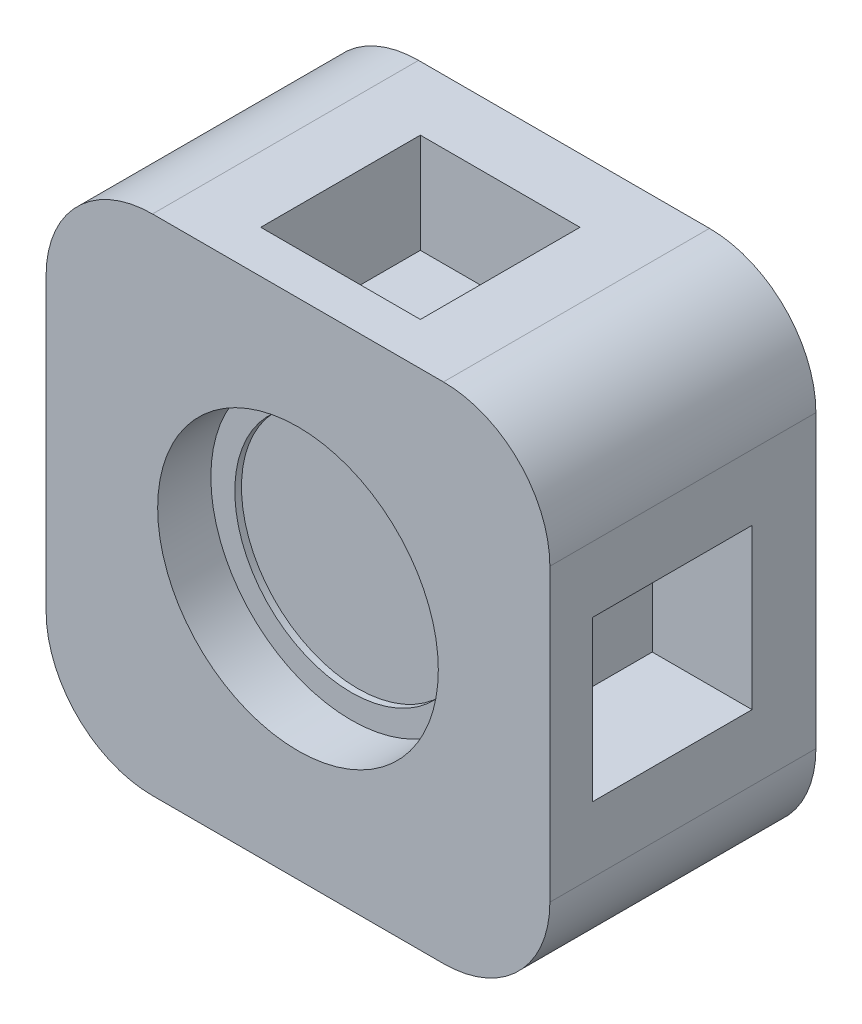
ISO-10303-21;
HEADER;
FILE_DESCRIPTION(('STEP AP214'),'2;1');
FILE_NAME('part.step','',(''),(''),'','','');
FILE_SCHEMA(('AUTOMOTIVE_DESIGN { 1 0 10303 214 1 1 1 1 }'));
ENDSEC;
DATA;
#1=APPLICATION_CONTEXT('core data for automotive mechanical design processes');
#2=APPLICATION_PROTOCOL_DEFINITION('international standard','automotive_design',2000,#1);
#3=PRODUCT_CONTEXT('',#1,'mechanical');
#4=PRODUCT('Part','Part','',(#3));
#5=PRODUCT_RELATED_PRODUCT_CATEGORY('part','',(#4));
#6=PRODUCT_DEFINITION_FORMATION('','',#4);
#7=PRODUCT_DEFINITION_CONTEXT('part definition',#1,'design');
#8=PRODUCT_DEFINITION('design','',#6,#7);
#9=PRODUCT_DEFINITION_SHAPE('','',#8);
#10=(LENGTH_UNIT() NAMED_UNIT(*) SI_UNIT(.MILLI.,.METRE.));
#11=(NAMED_UNIT(*) PLANE_ANGLE_UNIT() SI_UNIT($,.RADIAN.));
#12=(NAMED_UNIT(*) SI_UNIT($,.STERADIAN.) SOLID_ANGLE_UNIT());
#13=UNCERTAINTY_MEASURE_WITH_UNIT(LENGTH_MEASURE(1.E-05),#10,'distance_accuracy_value','');
#14=(GEOMETRIC_REPRESENTATION_CONTEXT(3) GLOBAL_UNCERTAINTY_ASSIGNED_CONTEXT((#13)) GLOBAL_UNIT_ASSIGNED_CONTEXT((#10,
#11,#12)) REPRESENTATION_CONTEXT('',''));
#15=CARTESIAN_POINT('',(0.,0.,0.));
#16=DIRECTION('',(0.,0.,1.));
#17=DIRECTION('',(1.,0.,0.));
#18=AXIS2_PLACEMENT_3D('',#15,#16,#17);
#19=CARTESIAN_POINT('',(24.93671752344,-8.93671752343896,-22.9367175234421));
#20=DIRECTION('',(0.,1.,1.09079412169422E-13));
#21=DIRECTION('',(1.,0.,0.));
#22=AXIS2_PLACEMENT_3D('',#19,#20,#21);
#23=PLANE('',#22);
#24=DIRECTION('',(1.,0.,0.));
#25=VECTOR('',#24,1.);
#26=CARTESIAN_POINT('',(0.,-8.93671752343947,-18.1367175234421));
#27=LINE('',#26,#25);
#28=CARTESIAN_POINT('',(0.,-8.93671752343947,-18.1367175234421));
#29=VERTEX_POINT('',#28);
#30=CARTESIAN_POINT('',(12.,-8.93671752343947,-18.1367175234421));
#31=VERTEX_POINT('',#30);
#32=EDGE_CURVE('E224',#29,#31,#27,.T.);
#33=ORIENTED_EDGE('',*,*,#32,.F.);
#34=DIRECTION('',(0.,1.09079412169422E-13,-1.));
#35=VECTOR('',#34,1.);
#36=CARTESIAN_POINT('',(0.,-8.93671752344078,-6.13671752344211));
#37=LINE('',#36,#35);
#38=CARTESIAN_POINT('',(0.,-8.93671752344078,-6.13671752344211));
#39=VERTEX_POINT('',#38);
#40=EDGE_CURVE('E47',#39,#29,#37,.T.);
#41=ORIENTED_EDGE('',*,*,#40,.F.);
#42=DIRECTION('',(-1.,0.,0.));
#43=VECTOR('',#42,1.);
#44=CARTESIAN_POINT('',(12.,-8.93671752344078,-6.13671752344211));
#45=LINE('',#44,#43);
#46=CARTESIAN_POINT('',(12.,-8.93671752344078,-6.13671752344211));
#47=VERTEX_POINT('',#46);
#48=EDGE_CURVE('E212',#47,#39,#45,.T.);
#49=ORIENTED_EDGE('',*,*,#48,.F.);
#50=DIRECTION('',(0.,1.09079412169422E-13,-1.));
#51=VECTOR('',#50,1.);
#52=CARTESIAN_POINT('',(12.,-8.93671752344078,-6.13671752344211));
#53=LINE('',#52,#51);
#54=EDGE_CURVE('E215',#47,#31,#53,.T.);
#55=ORIENTED_EDGE('',*,*,#54,.T.);
#56=EDGE_LOOP('',(#33,#41,#49,#55));
#57=FACE_BOUND('',#56,.T.);
#58=DIRECTION('',(-1.,0.,0.));
#59=VECTOR('',#58,1.);
#60=CARTESIAN_POINT('',(24.93671752344,-8.93671752344113,-2.9367175234421));
#61=LINE('',#60,#59);
#62=CARTESIAN_POINT('',(16.93671752344,-8.93671752344113,-2.9367175234421));
#63=VERTEX_POINT('',#62);
#64=CARTESIAN_POINT('',(-4.93671752344002,-8.93671752344112,-2.9367175234421));
#65=VERTEX_POINT('',#64);
#66=EDGE_CURVE('E329',#63,#65,#61,.T.);
#67=ORIENTED_EDGE('',*,*,#66,.T.);
#68=DIRECTION('',(0.,-1.09079412169422E-13,1.));
#69=VECTOR('',#68,1.);
#70=CARTESIAN_POINT('',(-4.93671752344002,-8.93671752343894,-22.9367175234421));
#71=LINE('',#70,#69);
#72=CARTESIAN_POINT('',(-4.93671752344002,-8.93671752343894,-22.9367175234421));
#73=VERTEX_POINT('',#72);
#74=EDGE_CURVE('E371',#65,#73,#71,.F.);
#75=ORIENTED_EDGE('',*,*,#74,.T.);
#76=DIRECTION('',(-1.,0.,0.));
#77=VECTOR('',#76,1.);
#78=CARTESIAN_POINT('',(24.93671752344,-8.93671752343896,-22.9367175234421));
#79=LINE('',#78,#77);
#80=CARTESIAN_POINT('',(16.93671752344,-8.93671752343896,-22.9367175234421));
#81=VERTEX_POINT('',#80);
#82=EDGE_CURVE('E332',#81,#73,#79,.T.);
#83=ORIENTED_EDGE('',*,*,#82,.F.);
#84=DIRECTION('',(0.,-1.09079412169422E-13,1.));
#85=VECTOR('',#84,1.);
#86=CARTESIAN_POINT('',(16.93671752344,-8.93671752343896,-22.9367175234421));
#87=LINE('',#86,#85);
#88=EDGE_CURVE('E368',#81,#63,#87,.T.);
#89=ORIENTED_EDGE('',*,*,#88,.T.);
#90=EDGE_LOOP('',(#67,#75,#83,#89));
#91=FACE_BOUND('',#90,.T.);
#92=ADVANCED_FACE('F32',(#57,#91),#23,.F.);
#93=CARTESIAN_POINT('',(-12.93671752344,-8.93671752343894,-22.9367175234421));
#94=DIRECTION('',(1.,0.,0.));
#95=DIRECTION('',(0.,-1.,-1.09079412169422E-13));
#96=AXIS2_PLACEMENT_3D('',#93,#94,#95);
#97=PLANE('',#96);
#98=DIRECTION('',(0.,-1.,-1.09079412169422E-13));
#99=VECTOR('',#98,1.);
#100=CARTESIAN_POINT('',(-12.9367175234401,16.0000000000005,-18.1367175234394));
#101=LINE('',#100,#99);
#102=CARTESIAN_POINT('',(-12.93671752344,16.0000000000005,-18.1367175234394));
#103=VERTEX_POINT('',#102);
#104=CARTESIAN_POINT('',(-12.93671752344,4.00000000000051,-18.1367175234407));
#105=VERTEX_POINT('',#104);
#106=EDGE_CURVE('E278',#103,#105,#101,.T.);
#107=ORIENTED_EDGE('',*,*,#106,.F.);
#108=DIRECTION('',(0.,1.09079412169422E-13,-1.));
#109=VECTOR('',#108,1.);
#110=CARTESIAN_POINT('',(-12.9367175234401,15.9999999999992,-6.13671752343939));
#111=LINE('',#110,#109);
#112=CARTESIAN_POINT('',(-12.9367175234401,15.9999999999992,-6.13671752343939));
#113=VERTEX_POINT('',#112);
#114=EDGE_CURVE('E231',#113,#103,#111,.T.);
#115=ORIENTED_EDGE('',*,*,#114,.F.);
#116=DIRECTION('',(0.,1.,1.09079412169422E-13));
#117=VECTOR('',#116,1.);
#118=CARTESIAN_POINT('',(-12.93671752344,3.9999999999992,-6.1367175234407));
#119=LINE('',#118,#117);
#120=CARTESIAN_POINT('',(-12.93671752344,3.9999999999992,-6.1367175234407));
#121=VERTEX_POINT('',#120);
#122=EDGE_CURVE('E268',#121,#113,#119,.T.);
#123=ORIENTED_EDGE('',*,*,#122,.F.);
#124=DIRECTION('',(0.,1.09079412169422E-13,-1.));
#125=VECTOR('',#124,1.);
#126=CARTESIAN_POINT('',(-12.93671752344,3.9999999999992,-6.1367175234407));
#127=LINE('',#126,#125);
#128=EDGE_CURVE('E281',#121,#105,#127,.T.);
#129=ORIENTED_EDGE('',*,*,#128,.T.);
#130=EDGE_LOOP('',(#107,#115,#123,#129));
#131=FACE_BOUND('',#130,.T.);
#132=DIRECTION('',(0.,1.,1.09079412169422E-13));
#133=VECTOR('',#132,1.);
#134=CARTESIAN_POINT('',(-12.93671752344,-8.93671752343894,-22.9367175234421));
#135=LINE('',#134,#133);
#136=CARTESIAN_POINT('',(-12.93671752344,-0.936717523438942,-22.9367175234412));
#137=VERTEX_POINT('',#136);
#138=CARTESIAN_POINT('',(-12.93671752344,20.9367175234411,-22.9367175234388));
#139=VERTEX_POINT('',#138);
#140=EDGE_CURVE('E335',#137,#139,#135,.T.);
#141=ORIENTED_EDGE('',*,*,#140,.F.);
#142=DIRECTION('',(0.,-1.09079412169422E-13,1.));
#143=VECTOR('',#142,1.);
#144=CARTESIAN_POINT('',(-12.93671752344,-0.936717523438942,-22.9367175234412));
#145=LINE('',#144,#143);
#146=CARTESIAN_POINT('',(-12.93671752344,-0.936717523441124,-2.93671752344123));
#147=VERTEX_POINT('',#146);
#148=EDGE_CURVE('E357',#137,#147,#145,.T.);
#149=ORIENTED_EDGE('',*,*,#148,.T.);
#150=DIRECTION('',(0.,1.,1.09079412169422E-13));
#151=VECTOR('',#150,1.);
#152=CARTESIAN_POINT('',(-12.93671752344,-8.93671752344112,-2.9367175234421));
#153=LINE('',#152,#151);
#154=CARTESIAN_POINT('',(-12.93671752344,20.936717523439,-2.93671752343885));
#155=VERTEX_POINT('',#154);
#156=EDGE_CURVE('E348',#147,#155,#153,.T.);
#157=ORIENTED_EDGE('',*,*,#156,.T.);
#158=DIRECTION('',(0.,-1.09079412169422E-13,1.));
#159=VECTOR('',#158,1.);
#160=CARTESIAN_POINT('',(-12.93671752344,20.9367175234411,-22.9367175234388));
#161=LINE('',#160,#159);
#162=EDGE_CURVE('E345',#155,#139,#161,.F.);
#163=ORIENTED_EDGE('',*,*,#162,.T.);
#164=EDGE_LOOP('',(#141,#149,#157,#163));
#165=FACE_BOUND('',#164,.T.);
#166=ADVANCED_FACE('F422',(#131,#165),#97,.F.);
#167=CARTESIAN_POINT('',(24.93671752344,28.9367175234411,-22.936717523438));
#168=DIRECTION('',(0.,-1.,-1.09079412169422E-13));
#169=DIRECTION('',(-1.,0.,0.));
#170=AXIS2_PLACEMENT_3D('',#167,#168,#169);
#171=PLANE('',#170);
#172=DIRECTION('',(-1.,0.,0.));
#173=VECTOR('',#172,1.);
#174=CARTESIAN_POINT('',(12.,28.9367175234406,-18.136717523438));
#175=LINE('',#174,#173);
#176=CARTESIAN_POINT('',(12.,28.9367175234406,-18.136717523438));
#177=VERTEX_POINT('',#176);
#178=CARTESIAN_POINT('',(0.,28.9367175234406,-18.136717523438));
#179=VERTEX_POINT('',#178);
#180=EDGE_CURVE('E309',#177,#179,#175,.T.);
#181=ORIENTED_EDGE('',*,*,#180,.F.);
#182=DIRECTION('',(0.,1.09079412169422E-13,-1.));
#183=VECTOR('',#182,1.);
#184=CARTESIAN_POINT('',(12.,28.9367175234393,-6.13671752343797));
#185=LINE('',#184,#183);
#186=CARTESIAN_POINT('',(12.,28.9367175234393,-6.13671752343797));
#187=VERTEX_POINT('',#186);
#188=EDGE_CURVE('E288',#187,#177,#185,.T.);
#189=ORIENTED_EDGE('',*,*,#188,.F.);
#190=DIRECTION('',(1.,0.,0.));
#191=VECTOR('',#190,1.);
#192=CARTESIAN_POINT('',(0.,28.9367175234393,-6.13671752343797));
#193=LINE('',#192,#191);
#194=CARTESIAN_POINT('',(0.,28.9367175234393,-6.13671752343797));
#195=VERTEX_POINT('',#194);
#196=EDGE_CURVE('E299',#195,#187,#193,.T.);
#197=ORIENTED_EDGE('',*,*,#196,.F.);
#198=DIRECTION('',(0.,1.09079412169422E-13,-1.));
#199=VECTOR('',#198,1.);
#200=CARTESIAN_POINT('',(0.,28.9367175234393,-6.13671752343797));
#201=LINE('',#200,#199);
#202=EDGE_CURVE('E312',#195,#179,#201,.T.);
#203=ORIENTED_EDGE('',*,*,#202,.T.);
#204=EDGE_LOOP('',(#181,#189,#197,#203));
#205=FACE_BOUND('',#204,.T.);
#206=DIRECTION('',(1.,0.,0.));
#207=VECTOR('',#206,1.);
#208=CARTESIAN_POINT('',(24.93671752344,28.936717523439,-2.93671752343797));
#209=LINE('',#208,#207);
#210=CARTESIAN_POINT('',(-4.93671752344002,28.936717523439,-2.93671752343797));
#211=VERTEX_POINT('',#210);
#212=CARTESIAN_POINT('',(16.93671752344,28.936717523439,-2.93671752343797));
#213=VERTEX_POINT('',#212);
#214=EDGE_CURVE('E351',#211,#213,#209,.T.);
#215=ORIENTED_EDGE('',*,*,#214,.T.);
#216=DIRECTION('',(0.,-1.09079412169422E-13,1.));
#217=VECTOR('',#216,1.);
#218=CARTESIAN_POINT('',(16.93671752344,28.9367175234411,-22.936717523438));
#219=LINE('',#218,#217);
#220=CARTESIAN_POINT('',(16.93671752344,28.9367175234411,-22.936717523438));
#221=VERTEX_POINT('',#220);
#222=EDGE_CURVE('E11',#213,#221,#219,.F.);
#223=ORIENTED_EDGE('',*,*,#222,.T.);
#224=DIRECTION('',(1.,0.,0.));
#225=VECTOR('',#224,1.);
#226=CARTESIAN_POINT('',(24.93671752344,28.9367175234411,-22.936717523438));
#227=LINE('',#226,#225);
#228=CARTESIAN_POINT('',(-4.93671752344002,28.9367175234411,-22.936717523438));
#229=VERTEX_POINT('',#228);
#230=EDGE_CURVE('E339',#229,#221,#227,.T.);
#231=ORIENTED_EDGE('',*,*,#230,.F.);
#232=DIRECTION('',(0.,-1.09079412169422E-13,1.));
#233=VECTOR('',#232,1.);
#234=CARTESIAN_POINT('',(-4.93671752344002,28.9367175234411,-22.936717523438));
#235=LINE('',#234,#233);
#236=EDGE_CURVE('E40',#229,#211,#235,.T.);
#237=ORIENTED_EDGE('',*,*,#236,.T.);
#238=EDGE_LOOP('',(#215,#223,#231,#237));
#239=FACE_BOUND('',#238,.T.);
#240=ADVANCED_FACE('F390',(#205,#239),#171,.F.);
#241=CARTESIAN_POINT('',(24.93671752344,-8.93671752343896,-22.9367175234421));
#242=DIRECTION('',(-1.,0.,0.));
#243=DIRECTION('',(0.,1.,1.09079412169422E-13));
#244=AXIS2_PLACEMENT_3D('',#241,#242,#243);
#245=PLANE('',#244);
#246=DIRECTION('',(0.,1.,1.09079412169422E-13));
#247=VECTOR('',#246,1.);
#248=CARTESIAN_POINT('',(24.9367175234401,4.00000000000077,-18.1367175234407));
#249=LINE('',#248,#247);
#250=CARTESIAN_POINT('',(24.93671752344,4.00000000000069,-18.1367175234407));
#251=VERTEX_POINT('',#250);
#252=CARTESIAN_POINT('',(24.93671752344,16.0000000000008,-18.1367175234394));
#253=VERTEX_POINT('',#252);
#254=EDGE_CURVE('E249',#251,#253,#249,.T.);
#255=ORIENTED_EDGE('',*,*,#254,.F.);
#256=DIRECTION('',(0.,1.09079412169422E-13,-1.));
#257=VECTOR('',#256,1.);
#258=CARTESIAN_POINT('',(24.9367175234401,3.99999999999947,-6.1367175234407));
#259=LINE('',#258,#257);
#260=CARTESIAN_POINT('',(24.9367175234401,3.99999999999947,-6.1367175234407));
#261=VERTEX_POINT('',#260);
#262=EDGE_CURVE('E55',#261,#251,#259,.T.);
#263=ORIENTED_EDGE('',*,*,#262,.F.);
#264=DIRECTION('',(0.,-1.,-1.09079412169422E-13));
#265=VECTOR('',#264,1.);
#266=CARTESIAN_POINT('',(24.93671752344,15.9999999999995,-6.13671752343939));
#267=LINE('',#266,#265);
#268=CARTESIAN_POINT('',(24.93671752344,15.9999999999995,-6.13671752343939));
#269=VERTEX_POINT('',#268);
#270=EDGE_CURVE('E239',#269,#261,#267,.T.);
#271=ORIENTED_EDGE('',*,*,#270,.F.);
#272=DIRECTION('',(0.,1.09079412169422E-13,-1.));
#273=VECTOR('',#272,1.);
#274=CARTESIAN_POINT('',(24.93671752344,15.9999999999995,-6.13671752343939));
#275=LINE('',#274,#273);
#276=EDGE_CURVE('E253',#269,#253,#275,.T.);
#277=ORIENTED_EDGE('',*,*,#276,.T.);
#278=EDGE_LOOP('',(#255,#263,#271,#277));
#279=FACE_BOUND('',#278,.T.);
#280=DIRECTION('',(0.,-1.,-1.09079412169422E-13));
#281=VECTOR('',#280,1.);
#282=CARTESIAN_POINT('',(24.93671752344,-8.93671752344113,-2.9367175234421));
#283=LINE('',#282,#281);
#284=CARTESIAN_POINT('',(24.93671752344,20.936717523439,-2.93671752343885));
#285=VERTEX_POINT('',#284);
#286=CARTESIAN_POINT('',(24.93671752344,-0.936717523441131,-2.93671752344123));
#287=VERTEX_POINT('',#286);
#288=EDGE_CURVE('E336',#285,#287,#283,.T.);
#289=ORIENTED_EDGE('',*,*,#288,.T.);
#290=DIRECTION('',(0.,-1.09079412169422E-13,1.));
#291=VECTOR('',#290,1.);
#292=CARTESIAN_POINT('',(24.93671752344,-0.936717523438949,-22.9367175234412));
#293=LINE('',#292,#291);
#294=CARTESIAN_POINT('',(24.93671752344,-0.936717523438949,-22.9367175234412));
#295=VERTEX_POINT('',#294);
#296=EDGE_CURVE('E384',#287,#295,#293,.F.);
#297=ORIENTED_EDGE('',*,*,#296,.T.);
#298=DIRECTION('',(0.,-1.,-1.09079412169422E-13));
#299=VECTOR('',#298,1.);
#300=CARTESIAN_POINT('',(24.93671752344,-8.93671752343896,-22.9367175234421));
#301=LINE('',#300,#299);
#302=CARTESIAN_POINT('',(24.93671752344,20.9367175234411,-22.9367175234388));
#303=VERTEX_POINT('',#302);
#304=EDGE_CURVE('E342',#303,#295,#301,.T.);
#305=ORIENTED_EDGE('',*,*,#304,.F.);
#306=DIRECTION('',(0.,-1.09079412169422E-13,1.));
#307=VECTOR('',#306,1.);
#308=CARTESIAN_POINT('',(24.93671752344,20.9367175234411,-22.9367175234388));
#309=LINE('',#308,#307);
#310=EDGE_CURVE('E381',#303,#285,#309,.T.);
#311=ORIENTED_EDGE('',*,*,#310,.T.);
#312=EDGE_LOOP('',(#289,#297,#305,#311));
#313=FACE_BOUND('',#312,.T.);
#314=ADVANCED_FACE('F404',(#279,#313),#245,.F.);
#315=CARTESIAN_POINT('',(0.,22.9367175234411,-22.9367175234386));
#316=DIRECTION('',(0.,1.09079412169422E-13,-1.));
#317=DIRECTION('',(0.,1.,1.09079412169422E-13));
#318=AXIS2_PLACEMENT_3D('',#315,#316,#317);
#319=PLANE('',#318);
#320=ORIENTED_EDGE('',*,*,#82,.T.);
#321=CARTESIAN_POINT('',(-4.93671752344002,-0.936717523438942,-22.9367175234412));
#322=DIRECTION('',(0.,1.09079412169422E-13,-1.));
#323=DIRECTION('',(0.,1.,1.09079412169422E-13));
#324=AXIS2_PLACEMENT_3D('',#321,#322,#323);
#325=CIRCLE('',#324,8.);
#326=EDGE_CURVE('E379',#73,#137,#325,.T.);
#327=ORIENTED_EDGE('',*,*,#326,.T.);
#328=ORIENTED_EDGE('',*,*,#140,.T.);
#329=CARTESIAN_POINT('',(-4.93671752344002,20.9367175234411,-22.9367175234388));
#330=DIRECTION('',(0.,1.09079412169422E-13,-1.));
#331=DIRECTION('',(0.,1.,1.09079412169422E-13));
#332=AXIS2_PLACEMENT_3D('',#329,#330,#331);
#333=CIRCLE('',#332,8.);
#334=EDGE_CURVE('E373',#139,#229,#333,.T.);
#335=ORIENTED_EDGE('',*,*,#334,.T.);
#336=ORIENTED_EDGE('',*,*,#230,.T.);
#337=CARTESIAN_POINT('',(16.93671752344,20.9367175234411,-22.9367175234388));
#338=DIRECTION('',(0.,1.09079412169422E-13,-1.));
#339=DIRECTION('',(0.,1.,1.09079412169422E-13));
#340=AXIS2_PLACEMENT_3D('',#337,#338,#339);
#341=CIRCLE('',#340,8.);
#342=EDGE_CURVE('E375',#221,#303,#341,.T.);
#343=ORIENTED_EDGE('',*,*,#342,.T.);
#344=ORIENTED_EDGE('',*,*,#304,.T.);
#345=CARTESIAN_POINT('',(16.93671752344,-0.936717523438949,-22.9367175234412));
#346=DIRECTION('',(0.,1.09079412169422E-13,-1.));
#347=DIRECTION('',(0.,1.,1.09079412169422E-13));
#348=AXIS2_PLACEMENT_3D('',#345,#346,#347);
#349=CIRCLE('',#348,8.);
#350=EDGE_CURVE('E377',#295,#81,#349,.T.);
#351=ORIENTED_EDGE('',*,*,#350,.T.);
#352=EDGE_LOOP('',(#320,#327,#328,#335,#336,#343,#344,#351));
#353=FACE_BOUND('',#352,.T.);
#354=ADVANCED_FACE('F408',(#353),#319,.T.);
#355=CARTESIAN_POINT('',(0.,22.936717523439,-2.93671752343863));
#356=DIRECTION('',(0.,1.09079412169422E-13,-1.));
#357=DIRECTION('',(0.,1.,1.09079412169422E-13));
#358=AXIS2_PLACEMENT_3D('',#355,#356,#357);
#359=PLANE('',#358);
#360=CARTESIAN_POINT('',(6.,9.99999999999892,-2.93671752344004));
#361=DIRECTION('',(0.,-1.09079412169422E-13,1.));
#362=DIRECTION('',(0.,-1.,-1.09079412169422E-13));
#363=AXIS2_PLACEMENT_3D('',#360,#361,#362);
#364=CIRCLE('',#363,10.55);
#365=CARTESIAN_POINT('',(6.,-0.550000000001086,-2.93671752344119));
#366=VERTEX_POINT('',#365);
#367=EDGE_CURVE('E319',#366,#366,#364,.T.);
#368=ORIENTED_EDGE('',*,*,#367,.F.);
#369=EDGE_LOOP('',(#368));
#370=FACE_BOUND('',#369,.T.);
#371=ORIENTED_EDGE('',*,*,#156,.F.);
#372=CARTESIAN_POINT('',(-4.93671752344002,-0.936717523441124,-2.93671752344123));
#373=DIRECTION('',(0.,1.09079412169422E-13,-1.));
#374=DIRECTION('',(0.,1.,1.09079412169422E-13));
#375=AXIS2_PLACEMENT_3D('',#372,#373,#374);
#376=CIRCLE('',#375,8.);
#377=EDGE_CURVE('E366',#147,#65,#376,.F.);
#378=ORIENTED_EDGE('',*,*,#377,.T.);
#379=ORIENTED_EDGE('',*,*,#66,.F.);
#380=CARTESIAN_POINT('',(16.93671752344,-0.936717523441131,-2.93671752344123));
#381=DIRECTION('',(0.,1.09079412169422E-13,-1.));
#382=DIRECTION('',(0.,1.,1.09079412169422E-13));
#383=AXIS2_PLACEMENT_3D('',#380,#381,#382);
#384=CIRCLE('',#383,8.);
#385=EDGE_CURVE('E364',#63,#287,#384,.F.);
#386=ORIENTED_EDGE('',*,*,#385,.T.);
#387=ORIENTED_EDGE('',*,*,#288,.F.);
#388=CARTESIAN_POINT('',(16.93671752344,20.936717523439,-2.93671752343885));
#389=DIRECTION('',(0.,1.09079412169422E-13,-1.));
#390=DIRECTION('',(0.,1.,1.09079412169422E-13));
#391=AXIS2_PLACEMENT_3D('',#388,#389,#390);
#392=CIRCLE('',#391,8.);
#393=EDGE_CURVE('E362',#285,#213,#392,.F.);
#394=ORIENTED_EDGE('',*,*,#393,.T.);
#395=ORIENTED_EDGE('',*,*,#214,.F.);
#396=CARTESIAN_POINT('',(-4.93671752344002,20.936717523439,-2.93671752343885));
#397=DIRECTION('',(0.,1.09079412169422E-13,-1.));
#398=DIRECTION('',(0.,1.,1.09079412169422E-13));
#399=AXIS2_PLACEMENT_3D('',#396,#397,#398);
#400=CIRCLE('',#399,8.);
#401=EDGE_CURVE('E360',#211,#155,#400,.F.);
#402=ORIENTED_EDGE('',*,*,#401,.T.);
#403=EDGE_LOOP('',(#371,#378,#379,#386,#387,#394,#395,#402));
#404=FACE_BOUND('',#403,.T.);
#405=ADVANCED_FACE('F396',(#370,#404),#359,.F.);
#406=CARTESIAN_POINT('',(6.,9.99999999999935,-6.93671752344004));
#407=DIRECTION('',(0.,-1.09079412169422E-13,1.));
#408=DIRECTION('',(0.,-1.,-1.09079412169422E-13));
#409=AXIS2_PLACEMENT_3D('',#406,#407,#408);
#410=CYLINDRICAL_SURFACE('',#409,10.55);
#411=CARTESIAN_POINT('',(6.,9.99999999999935,-6.93671752344004));
#412=DIRECTION('',(0.,-1.09079412169422E-13,1.));
#413=DIRECTION('',(0.,-1.,-1.09079412169422E-13));
#414=AXIS2_PLACEMENT_3D('',#411,#412,#413);
#415=CIRCLE('',#414,10.55);
#416=CARTESIAN_POINT('',(6.,-0.550000000000649,-6.93671752344119));
#417=VERTEX_POINT('',#416);
#418=EDGE_CURVE('E326',#417,#417,#415,.T.);
#419=ORIENTED_EDGE('',*,*,#418,.F.);
#420=EDGE_LOOP('',(#419));
#421=FACE_BOUND('',#420,.T.);
#422=ORIENTED_EDGE('',*,*,#367,.T.);
#423=EDGE_LOOP('',(#422));
#424=FACE_BOUND('',#423,.T.);
#425=ADVANCED_FACE('F535',(#421,#424),#410,.F.);
#426=CARTESIAN_POINT('',(6.,9.99999999999935,-6.93671752344004));
#427=DIRECTION('',(0.,-1.09079412169422E-13,1.));
#428=DIRECTION('',(0.,-1.,-1.09079412169422E-13));
#429=AXIS2_PLACEMENT_3D('',#426,#427,#428);
#430=PLANE('',#429);
#431=CARTESIAN_POINT('',(6.,9.99999999999935,-6.93671752344004));
#432=DIRECTION('',(0.,-1.09079412169422E-13,1.));
#433=DIRECTION('',(0.,-1.,-1.09079412169422E-13));
#434=AXIS2_PLACEMENT_3D('',#431,#432,#433);
#435=CIRCLE('',#434,8.75);
#436=CARTESIAN_POINT('',(6.,1.24999999999935,-6.93671752344099));
#437=VERTEX_POINT('',#436);
#438=EDGE_CURVE('E218',#437,#437,#435,.T.);
#439=ORIENTED_EDGE('',*,*,#438,.F.);
#440=EDGE_LOOP('',(#439));
#441=FACE_BOUND('',#440,.T.);
#442=ORIENTED_EDGE('',*,*,#418,.T.);
#443=EDGE_LOOP('',(#442));
#444=FACE_BOUND('',#443,.T.);
#445=ADVANCED_FACE('F525',(#441,#444),#430,.T.);
#446=CARTESIAN_POINT('',(12.,21.4367175234393,-6.13671752343879));
#447=DIRECTION('',(1.,0.,0.));
#448=DIRECTION('',(0.,-1.,-1.09079412169422E-13));
#449=AXIS2_PLACEMENT_3D('',#446,#447,#448);
#450=PLANE('',#449);
#451=ORIENTED_EDGE('',*,*,#188,.T.);
#452=DIRECTION('',(0.,1.,1.09079412169422E-13));
#453=VECTOR('',#452,1.);
#454=CARTESIAN_POINT('',(12.,21.4367175234406,-18.1367175234388));
#455=LINE('',#454,#453);
#456=CARTESIAN_POINT('',(12.,21.4367175234406,-18.1367175234388));
#457=VERTEX_POINT('',#456);
#458=EDGE_CURVE('E307',#457,#177,#455,.T.);
#459=ORIENTED_EDGE('',*,*,#458,.F.);
#460=DIRECTION('',(0.,1.09079412169422E-13,-1.));
#461=VECTOR('',#460,1.);
#462=CARTESIAN_POINT('',(12.,21.4367175234393,-6.13671752343879));
#463=LINE('',#462,#461);
#464=CARTESIAN_POINT('',(12.,21.4367175234393,-6.13671752343879));
#465=VERTEX_POINT('',#464);
#466=EDGE_CURVE('E295',#465,#457,#463,.T.);
#467=ORIENTED_EDGE('',*,*,#466,.F.);
#468=DIRECTION('',(0.,1.,1.09079412169422E-13));
#469=VECTOR('',#468,1.);
#470=CARTESIAN_POINT('',(12.,21.4367175234393,-6.13671752343879));
#471=LINE('',#470,#469);
#472=EDGE_CURVE('E317',#465,#187,#471,.T.);
#473=ORIENTED_EDGE('',*,*,#472,.T.);
#474=EDGE_LOOP('',(#451,#459,#467,#473));
#475=FACE_BOUND('',#474,.T.);
#476=ADVANCED_FACE('F517',(#475),#450,.F.);
#477=CARTESIAN_POINT('',(0.,21.4367175234393,-6.13671752343879));
#478=DIRECTION('',(0.,-1.09079412169422E-13,1.));
#479=DIRECTION('',(0.,-1.,-1.09079412169422E-13));
#480=AXIS2_PLACEMENT_3D('',#477,#478,#479);
#481=PLANE('',#480);
#482=ORIENTED_EDGE('',*,*,#196,.T.);
#483=ORIENTED_EDGE('',*,*,#472,.F.);
#484=DIRECTION('',(1.,0.,0.));
#485=VECTOR('',#484,1.);
#486=CARTESIAN_POINT('',(0.,21.4367175234393,-6.13671752343879));
#487=LINE('',#486,#485);
#488=CARTESIAN_POINT('',(0.,21.4367175234393,-6.13671752343879));
#489=VERTEX_POINT('',#488);
#490=EDGE_CURVE('E304',#489,#465,#487,.T.);
#491=ORIENTED_EDGE('',*,*,#490,.F.);
#492=DIRECTION('',(0.,1.,1.09079412169422E-13));
#493=VECTOR('',#492,1.);
#494=CARTESIAN_POINT('',(0.,21.4367175234393,-6.13671752343879));
#495=LINE('',#494,#493);
#496=EDGE_CURVE('E320',#489,#195,#495,.T.);
#497=ORIENTED_EDGE('',*,*,#496,.T.);
#498=EDGE_LOOP('',(#482,#483,#491,#497));
#499=FACE_BOUND('',#498,.T.);
#500=ADVANCED_FACE('F509',(#499),#481,.F.);
#501=CARTESIAN_POINT('',(0.,21.4367175234393,-6.13671752343879));
#502=DIRECTION('',(1.,0.,0.));
#503=DIRECTION('',(0.,-1.,-1.09079412169422E-13));
#504=AXIS2_PLACEMENT_3D('',#501,#502,#503);
#505=PLANE('',#504);
#506=ORIENTED_EDGE('',*,*,#202,.F.);
#507=ORIENTED_EDGE('',*,*,#496,.F.);
#508=DIRECTION('',(0.,1.09079412169422E-13,-1.));
#509=VECTOR('',#508,1.);
#510=CARTESIAN_POINT('',(0.,21.4367175234393,-6.13671752343879));
#511=LINE('',#510,#509);
#512=CARTESIAN_POINT('',(0.,21.4367175234406,-18.1367175234388));
#513=VERTEX_POINT('',#512);
#514=EDGE_CURVE('E302',#489,#513,#511,.T.);
#515=ORIENTED_EDGE('',*,*,#514,.T.);
#516=DIRECTION('',(0.,1.,1.09079412169422E-13));
#517=VECTOR('',#516,1.);
#518=CARTESIAN_POINT('',(0.,21.4367175234406,-18.1367175234388));
#519=LINE('',#518,#517);
#520=EDGE_CURVE('E322',#513,#179,#519,.T.);
#521=ORIENTED_EDGE('',*,*,#520,.T.);
#522=EDGE_LOOP('',(#506,#507,#515,#521));
#523=FACE_BOUND('',#522,.T.);
#524=ADVANCED_FACE('F499',(#523),#505,.T.);
#525=CARTESIAN_POINT('',(12.,21.4367175234406,-18.1367175234388));
#526=DIRECTION('',(0.,1.09079412169422E-13,-1.));
#527=DIRECTION('',(0.,1.,1.09079412169422E-13));
#528=AXIS2_PLACEMENT_3D('',#525,#526,#527);
#529=PLANE('',#528);
#530=ORIENTED_EDGE('',*,*,#180,.T.);
#531=ORIENTED_EDGE('',*,*,#520,.F.);
#532=DIRECTION('',(-1.,0.,0.));
#533=VECTOR('',#532,1.);
#534=CARTESIAN_POINT('',(12.,21.4367175234406,-18.1367175234388));
#535=LINE('',#534,#533);
#536=EDGE_CURVE('E298',#457,#513,#535,.T.);
#537=ORIENTED_EDGE('',*,*,#536,.F.);
#538=ORIENTED_EDGE('',*,*,#458,.T.);
#539=EDGE_LOOP('',(#530,#531,#537,#538));
#540=FACE_BOUND('',#539,.T.);
#541=ADVANCED_FACE('F488',(#540),#529,.F.);
#542=CARTESIAN_POINT('',(0.,21.436717523439,-2.93671752343879));
#543=DIRECTION('',(0.,1.,1.09079412169422E-13));
#544=DIRECTION('',(1.,0.,0.));
#545=AXIS2_PLACEMENT_3D('',#542,#543,#544);
#546=PLANE('',#545);
#547=ORIENTED_EDGE('',*,*,#466,.T.);
#548=ORIENTED_EDGE('',*,*,#536,.T.);
#549=ORIENTED_EDGE('',*,*,#514,.F.);
#550=ORIENTED_EDGE('',*,*,#490,.T.);
#551=EDGE_LOOP('',(#547,#548,#549,#550));
#552=FACE_BOUND('',#551,.T.);
#553=ADVANCED_FACE('F445',(#552),#546,.T.);
#554=CARTESIAN_POINT('',(-4.93671752344002,-0.936717523438942,-22.9367175234412));
#555=DIRECTION('',(0.,-1.09079412169422E-13,1.));
#556=DIRECTION('',(0.,-1.,-1.09079412169422E-13));
#557=AXIS2_PLACEMENT_3D('',#554,#555,#556);
#558=CYLINDRICAL_SURFACE('',#557,8.);
#559=ORIENTED_EDGE('',*,*,#326,.F.);
#560=ORIENTED_EDGE('',*,*,#74,.F.);
#561=ORIENTED_EDGE('',*,*,#377,.F.);
#562=ORIENTED_EDGE('',*,*,#148,.F.);
#563=EDGE_LOOP('',(#559,#560,#561,#562));
#564=FACE_BOUND('',#563,.T.);
#565=ADVANCED_FACE('F419',(#564),#558,.T.);
#566=CARTESIAN_POINT('',(16.93671752344,-0.936717523438949,-22.9367175234412));
#567=DIRECTION('',(0.,-1.09079412169422E-13,1.));
#568=DIRECTION('',(0.,-1.,-1.09079412169422E-13));
#569=AXIS2_PLACEMENT_3D('',#566,#567,#568);
#570=CYLINDRICAL_SURFACE('',#569,8.);
#571=ORIENTED_EDGE('',*,*,#350,.F.);
#572=ORIENTED_EDGE('',*,*,#296,.F.);
#573=ORIENTED_EDGE('',*,*,#385,.F.);
#574=ORIENTED_EDGE('',*,*,#88,.F.);
#575=EDGE_LOOP('',(#571,#572,#573,#574));
#576=FACE_BOUND('',#575,.T.);
#577=ADVANCED_FACE('F412',(#576),#570,.T.);
#578=CARTESIAN_POINT('',(16.93671752344,20.9367175234411,-22.9367175234388));
#579=DIRECTION('',(0.,-1.09079412169422E-13,1.));
#580=DIRECTION('',(0.,-1.,-1.09079412169422E-13));
#581=AXIS2_PLACEMENT_3D('',#578,#579,#580);
#582=CYLINDRICAL_SURFACE('',#581,8.);
#583=ORIENTED_EDGE('',*,*,#342,.F.);
#584=ORIENTED_EDGE('',*,*,#222,.F.);
#585=ORIENTED_EDGE('',*,*,#393,.F.);
#586=ORIENTED_EDGE('',*,*,#310,.F.);
#587=EDGE_LOOP('',(#583,#584,#585,#586));
#588=FACE_BOUND('',#587,.T.);
#589=ADVANCED_FACE('F401',(#588),#582,.T.);
#590=CARTESIAN_POINT('',(-4.93671752344002,20.9367175234411,-22.9367175234388));
#591=DIRECTION('',(0.,-1.09079412169422E-13,1.));
#592=DIRECTION('',(0.,-1.,-1.09079412169422E-13));
#593=AXIS2_PLACEMENT_3D('',#590,#591,#592);
#594=CYLINDRICAL_SURFACE('',#593,8.);
#595=ORIENTED_EDGE('',*,*,#334,.F.);
#596=ORIENTED_EDGE('',*,*,#162,.F.);
#597=ORIENTED_EDGE('',*,*,#401,.F.);
#598=ORIENTED_EDGE('',*,*,#236,.F.);
#599=EDGE_LOOP('',(#595,#596,#597,#598));
#600=FACE_BOUND('',#599,.T.);
#601=ADVANCED_FACE('F34',(#600),#594,.T.);
#602=CARTESIAN_POINT('',(-5.43671752344006,15.9999999999992,-6.13671752343939));
#603=DIRECTION('',(0.,1.,1.09079412169422E-13));
#604=DIRECTION('',(1.,0.,0.));
#605=AXIS2_PLACEMENT_3D('',#602,#603,#604);
#606=PLANE('',#605);
#607=ORIENTED_EDGE('',*,*,#114,.T.);
#608=DIRECTION('',(-1.,0.,0.));
#609=VECTOR('',#608,1.);
#610=CARTESIAN_POINT('',(-5.43671752344006,16.0000000000005,-18.1367175234394));
#611=LINE('',#610,#609);
#612=CARTESIAN_POINT('',(-5.43671752344006,16.0000000000005,-18.1367175234394));
#613=VERTEX_POINT('',#612);
#614=EDGE_CURVE('E276',#613,#103,#611,.T.);
#615=ORIENTED_EDGE('',*,*,#614,.F.);
#616=DIRECTION('',(0.,1.09079412169422E-13,-1.));
#617=VECTOR('',#616,1.);
#618=CARTESIAN_POINT('',(-5.43671752344006,15.9999999999992,-6.13671752343939));
#619=LINE('',#618,#617);
#620=CARTESIAN_POINT('',(-5.43671752344006,15.9999999999992,-6.13671752343939));
#621=VERTEX_POINT('',#620);
#622=EDGE_CURVE('E264',#621,#613,#619,.T.);
#623=ORIENTED_EDGE('',*,*,#622,.F.);
#624=DIRECTION('',(-1.,0.,0.));
#625=VECTOR('',#624,1.);
#626=CARTESIAN_POINT('',(-5.43671752344006,15.9999999999992,-6.13671752343939));
#627=LINE('',#626,#625);
#628=EDGE_CURVE('E286',#621,#113,#627,.T.);
#629=ORIENTED_EDGE('',*,*,#628,.T.);
#630=EDGE_LOOP('',(#607,#615,#623,#629));
#631=FACE_BOUND('',#630,.T.);
#632=ADVANCED_FACE('F425',(#631),#606,.F.);
#633=CARTESIAN_POINT('',(-5.43671752344002,3.99999999999923,-6.1367175234407));
#634=DIRECTION('',(0.,-1.09079412169422E-13,1.));
#635=DIRECTION('',(0.,-1.,-1.09079412169422E-13));
#636=AXIS2_PLACEMENT_3D('',#633,#634,#635);
#637=PLANE('',#636);
#638=ORIENTED_EDGE('',*,*,#122,.T.);
#639=ORIENTED_EDGE('',*,*,#628,.F.);
#640=DIRECTION('',(0.,1.,1.09079412169422E-13));
#641=VECTOR('',#640,1.);
#642=CARTESIAN_POINT('',(-5.43671752344002,3.99999999999923,-6.1367175234407));
#643=LINE('',#642,#641);
#644=CARTESIAN_POINT('',(-5.43671752344002,3.99999999999923,-6.1367175234407));
#645=VERTEX_POINT('',#644);
#646=EDGE_CURVE('E273',#645,#621,#643,.T.);
#647=ORIENTED_EDGE('',*,*,#646,.F.);
#648=DIRECTION('',(-1.,0.,0.));
#649=VECTOR('',#648,1.);
#650=CARTESIAN_POINT('',(-5.43671752344002,3.99999999999923,-6.1367175234407));
#651=LINE('',#650,#649);
#652=EDGE_CURVE('E289',#645,#121,#651,.T.);
#653=ORIENTED_EDGE('',*,*,#652,.T.);
#654=EDGE_LOOP('',(#638,#639,#647,#653));
#655=FACE_BOUND('',#654,.T.);
#656=ADVANCED_FACE('F430',(#655),#637,.F.);
#657=CARTESIAN_POINT('',(-5.43671752344002,3.99999999999923,-6.1367175234407));
#658=DIRECTION('',(0.,1.,1.09079412169422E-13));
#659=DIRECTION('',(1.,0.,0.));
#660=AXIS2_PLACEMENT_3D('',#657,#658,#659);
#661=PLANE('',#660);
#662=ORIENTED_EDGE('',*,*,#128,.F.);
#663=ORIENTED_EDGE('',*,*,#652,.F.);
#664=DIRECTION('',(0.,1.09079412169422E-13,-1.));
#665=VECTOR('',#664,1.);
#666=CARTESIAN_POINT('',(-5.43671752344002,3.99999999999923,-6.1367175234407));
#667=LINE('',#666,#665);
#668=CARTESIAN_POINT('',(-5.43671752344002,4.00000000000054,-18.1367175234407));
#669=VERTEX_POINT('',#668);
#670=EDGE_CURVE('E271',#645,#669,#667,.T.);
#671=ORIENTED_EDGE('',*,*,#670,.T.);
#672=DIRECTION('',(-1.,0.,0.));
#673=VECTOR('',#672,1.);
#674=CARTESIAN_POINT('',(-5.43671752344002,4.00000000000054,-18.1367175234407));
#675=LINE('',#674,#673);
#676=EDGE_CURVE('E291',#669,#105,#675,.T.);
#677=ORIENTED_EDGE('',*,*,#676,.T.);
#678=EDGE_LOOP('',(#662,#663,#671,#677));
#679=FACE_BOUND('',#678,.T.);
#680=ADVANCED_FACE('F593',(#679),#661,.T.);
#681=CARTESIAN_POINT('',(-5.43671752344006,16.0000000000005,-18.1367175234394));
#682=DIRECTION('',(0.,1.09079412169422E-13,-1.));
#683=DIRECTION('',(0.,1.,1.09079412169422E-13));
#684=AXIS2_PLACEMENT_3D('',#681,#682,#683);
#685=PLANE('',#684);
#686=ORIENTED_EDGE('',*,*,#106,.T.);
#687=ORIENTED_EDGE('',*,*,#676,.F.);
#688=DIRECTION('',(0.,-1.,-1.09079412169422E-13));
#689=VECTOR('',#688,1.);
#690=CARTESIAN_POINT('',(-5.43671752344006,16.0000000000005,-18.1367175234394));
#691=LINE('',#690,#689);
#692=EDGE_CURVE('E267',#613,#669,#691,.T.);
#693=ORIENTED_EDGE('',*,*,#692,.F.);
#694=ORIENTED_EDGE('',*,*,#614,.T.);
#695=EDGE_LOOP('',(#686,#687,#693,#694));
#696=FACE_BOUND('',#695,.T.);
#697=ADVANCED_FACE('F589',(#696),#685,.F.);
#698=CARTESIAN_POINT('',(-5.43671752344002,3.99999999999888,-2.93671752344069));
#699=DIRECTION('',(-1.,0.,0.));
#700=DIRECTION('',(0.,1.,1.09079412169422E-13));
#701=AXIS2_PLACEMENT_3D('',#698,#699,#700);
#702=PLANE('',#701);
#703=ORIENTED_EDGE('',*,*,#622,.T.);
#704=ORIENTED_EDGE('',*,*,#692,.T.);
#705=ORIENTED_EDGE('',*,*,#670,.F.);
#706=ORIENTED_EDGE('',*,*,#646,.T.);
#707=EDGE_LOOP('',(#703,#704,#705,#706));
#708=FACE_BOUND('',#707,.T.);
#709=ADVANCED_FACE('F592',(#708),#702,.T.);
#710=CARTESIAN_POINT('',(17.4367175234401,3.99999999999939,-6.1367175234407));
#711=DIRECTION('',(0.,-1.,-1.09079412169422E-13));
#712=DIRECTION('',(-1.,0.,0.));
#713=AXIS2_PLACEMENT_3D('',#710,#711,#712);
#714=PLANE('',#713);
#715=ORIENTED_EDGE('',*,*,#262,.T.);
#716=DIRECTION('',(1.,0.,0.));
#717=VECTOR('',#716,1.);
#718=CARTESIAN_POINT('',(17.4367175234401,4.00000000000069,-18.1367175234407));
#719=LINE('',#718,#717);
#720=CARTESIAN_POINT('',(17.4367175234401,4.00000000000069,-18.1367175234407));
#721=VERTEX_POINT('',#720);
#722=EDGE_CURVE('E247',#721,#251,#719,.T.);
#723=ORIENTED_EDGE('',*,*,#722,.F.);
#724=DIRECTION('',(0.,1.09079412169422E-13,-1.));
#725=VECTOR('',#724,1.);
#726=CARTESIAN_POINT('',(17.4367175234401,3.99999999999939,-6.1367175234407));
#727=LINE('',#726,#725);
#728=CARTESIAN_POINT('',(17.4367175234401,3.99999999999939,-6.1367175234407));
#729=VERTEX_POINT('',#728);
#730=EDGE_CURVE('E235',#729,#721,#727,.T.);
#731=ORIENTED_EDGE('',*,*,#730,.F.);
#732=DIRECTION('',(1.,0.,0.));
#733=VECTOR('',#732,1.);
#734=CARTESIAN_POINT('',(17.4367175234401,3.99999999999939,-6.1367175234407));
#735=LINE('',#734,#733);
#736=EDGE_CURVE('E225',#729,#261,#735,.T.);
#737=ORIENTED_EDGE('',*,*,#736,.T.);
#738=EDGE_LOOP('',(#715,#723,#731,#737));
#739=FACE_BOUND('',#738,.T.);
#740=ADVANCED_FACE('F603',(#739),#714,.F.);
#741=CARTESIAN_POINT('',(17.43671752344,15.9999999999994,-6.13671752343939));
#742=DIRECTION('',(0.,-1.09079412169422E-13,1.));
#743=DIRECTION('',(0.,-1.,-1.09079412169422E-13));
#744=AXIS2_PLACEMENT_3D('',#741,#742,#743);
#745=PLANE('',#744);
#746=ORIENTED_EDGE('',*,*,#270,.T.);
#747=ORIENTED_EDGE('',*,*,#736,.F.);
#748=DIRECTION('',(0.,-1.,-1.09079412169422E-13));
#749=VECTOR('',#748,1.);
#750=CARTESIAN_POINT('',(17.43671752344,15.9999999999994,-6.13671752343939));
#751=LINE('',#750,#749);
#752=CARTESIAN_POINT('',(17.43671752344,15.9999999999994,-6.13671752343939));
#753=VERTEX_POINT('',#752);
#754=EDGE_CURVE('E244',#753,#729,#751,.T.);
#755=ORIENTED_EDGE('',*,*,#754,.F.);
#756=DIRECTION('',(1.,0.,0.));
#757=VECTOR('',#756,1.);
#758=CARTESIAN_POINT('',(17.43671752344,15.9999999999994,-6.13671752343939));
#759=LINE('',#758,#757);
#760=EDGE_CURVE('E259',#753,#269,#759,.T.);
#761=ORIENTED_EDGE('',*,*,#760,.T.);
#762=EDGE_LOOP('',(#746,#747,#755,#761));
#763=FACE_BOUND('',#762,.T.);
#764=ADVANCED_FACE('F607',(#763),#745,.F.);
#765=CARTESIAN_POINT('',(17.43671752344,15.9999999999994,-6.13671752343939));
#766=DIRECTION('',(0.,-1.,-1.09079412169422E-13));
#767=DIRECTION('',(-1.,0.,0.));
#768=AXIS2_PLACEMENT_3D('',#765,#766,#767);
#769=PLANE('',#768);
#770=ORIENTED_EDGE('',*,*,#276,.F.);
#771=ORIENTED_EDGE('',*,*,#760,.F.);
#772=DIRECTION('',(0.,1.09079412169422E-13,-1.));
#773=VECTOR('',#772,1.);
#774=CARTESIAN_POINT('',(17.43671752344,15.9999999999994,-6.13671752343939));
#775=LINE('',#774,#773);
#776=CARTESIAN_POINT('',(17.43671752344,16.0000000000007,-18.1367175234394));
#777=VERTEX_POINT('',#776);
#778=EDGE_CURVE('E242',#753,#777,#775,.T.);
#779=ORIENTED_EDGE('',*,*,#778,.T.);
#780=DIRECTION('',(1.,0.,0.));
#781=VECTOR('',#780,1.);
#782=CARTESIAN_POINT('',(17.43671752344,16.0000000000007,-18.1367175234394));
#783=LINE('',#782,#781);
#784=EDGE_CURVE('E261',#777,#253,#783,.T.);
#785=ORIENTED_EDGE('',*,*,#784,.T.);
#786=EDGE_LOOP('',(#770,#771,#779,#785));
#787=FACE_BOUND('',#786,.T.);
#788=ADVANCED_FACE('F612',(#787),#769,.T.);
#789=CARTESIAN_POINT('',(17.4367175234401,4.00000000000069,-18.1367175234407));
#790=DIRECTION('',(0.,1.09079412169422E-13,-1.));
#791=DIRECTION('',(0.,1.,1.09079412169422E-13));
#792=AXIS2_PLACEMENT_3D('',#789,#790,#791);
#793=PLANE('',#792);
#794=ORIENTED_EDGE('',*,*,#254,.T.);
#795=ORIENTED_EDGE('',*,*,#784,.F.);
#796=DIRECTION('',(0.,1.,1.09079412169422E-13));
#797=VECTOR('',#796,1.);
#798=CARTESIAN_POINT('',(17.4367175234401,4.00000000000069,-18.1367175234407));
#799=LINE('',#798,#797);
#800=EDGE_CURVE('E238',#721,#777,#799,.T.);
#801=ORIENTED_EDGE('',*,*,#800,.F.);
#802=ORIENTED_EDGE('',*,*,#722,.T.);
#803=EDGE_LOOP('',(#794,#795,#801,#802));
#804=FACE_BOUND('',#803,.T.);
#805=ADVANCED_FACE('F608',(#804),#793,.F.);
#806=CARTESIAN_POINT('',(17.43671752344,15.999999999999,-2.93671752343938));
#807=DIRECTION('',(1.,0.,0.));
#808=DIRECTION('',(0.,-1.,-1.09079412169422E-13));
#809=AXIS2_PLACEMENT_3D('',#806,#807,#808);
#810=PLANE('',#809);
#811=ORIENTED_EDGE('',*,*,#730,.T.);
#812=ORIENTED_EDGE('',*,*,#800,.T.);
#813=ORIENTED_EDGE('',*,*,#778,.F.);
#814=ORIENTED_EDGE('',*,*,#754,.T.);
#815=EDGE_LOOP('',(#811,#812,#813,#814));
#816=FACE_BOUND('',#815,.T.);
#817=ADVANCED_FACE('F611',(#816),#810,.T.);
#818=CARTESIAN_POINT('',(0.,-1.43671752344078,-6.13671752344129));
#819=DIRECTION('',(-1.,0.,0.));
#820=DIRECTION('',(0.,1.,1.09079412169422E-13));
#821=AXIS2_PLACEMENT_3D('',#818,#819,#820);
#822=PLANE('',#821);
#823=ORIENTED_EDGE('',*,*,#40,.T.);
#824=DIRECTION('',(0.,-1.,-1.09079412169422E-13));
#825=VECTOR('',#824,1.);
#826=CARTESIAN_POINT('',(0.,-1.43671752343947,-18.1367175234413));
#827=LINE('',#826,#825);
#828=CARTESIAN_POINT('',(0.,-1.43671752343947,-18.1367175234413));
#829=VERTEX_POINT('',#828);
#830=EDGE_CURVE('E190',#829,#29,#827,.T.);
#831=ORIENTED_EDGE('',*,*,#830,.F.);
#832=DIRECTION('',(0.,1.09079412169422E-13,-1.));
#833=VECTOR('',#832,1.);
#834=CARTESIAN_POINT('',(0.,-1.43671752344078,-6.13671752344129));
#835=LINE('',#834,#833);
#836=CARTESIAN_POINT('',(0.,-1.43671752344078,-6.13671752344129));
#837=VERTEX_POINT('',#836);
#838=EDGE_CURVE('E194',#837,#829,#835,.T.);
#839=ORIENTED_EDGE('',*,*,#838,.F.);
#840=DIRECTION('',(0.,-1.,-1.09079412169422E-13));
#841=VECTOR('',#840,1.);
#842=CARTESIAN_POINT('',(0.,-1.43671752344078,-6.13671752344129));
#843=LINE('',#842,#841);
#844=EDGE_CURVE('E229',#837,#39,#843,.T.);
#845=ORIENTED_EDGE('',*,*,#844,.T.);
#846=EDGE_LOOP('',(#823,#831,#839,#845));
#847=FACE_BOUND('',#846,.T.);
#848=ADVANCED_FACE('F192',(#847),#822,.F.);
#849=CARTESIAN_POINT('',(12.,-1.43671752344078,-6.13671752344129));
#850=DIRECTION('',(0.,-1.09079412169422E-13,1.));
#851=DIRECTION('',(0.,-1.,-1.09079412169422E-13));
#852=AXIS2_PLACEMENT_3D('',#849,#850,#851);
#853=PLANE('',#852);
#854=ORIENTED_EDGE('',*,*,#48,.T.);
#855=ORIENTED_EDGE('',*,*,#844,.F.);
#856=DIRECTION('',(-1.,0.,0.));
#857=VECTOR('',#856,1.);
#858=CARTESIAN_POINT('',(12.,-1.43671752344078,-6.13671752344129));
#859=LINE('',#858,#857);
#860=CARTESIAN_POINT('',(12.,-1.43671752344078,-6.13671752344129));
#861=VERTEX_POINT('',#860);
#862=EDGE_CURVE('E200',#861,#837,#859,.T.);
#863=ORIENTED_EDGE('',*,*,#862,.F.);
#864=DIRECTION('',(0.,-1.,-1.09079412169422E-13));
#865=VECTOR('',#864,1.);
#866=CARTESIAN_POINT('',(12.,-1.43671752344078,-6.13671752344129));
#867=LINE('',#866,#865);
#868=EDGE_CURVE('E232',#861,#47,#867,.T.);
#869=ORIENTED_EDGE('',*,*,#868,.T.);
#870=EDGE_LOOP('',(#854,#855,#863,#869));
#871=FACE_BOUND('',#870,.T.);
#872=ADVANCED_FACE('F625',(#871),#853,.F.);
#873=CARTESIAN_POINT('',(12.,-1.43671752344078,-6.13671752344129));
#874=DIRECTION('',(-1.,0.,0.));
#875=DIRECTION('',(0.,1.,1.09079412169422E-13));
#876=AXIS2_PLACEMENT_3D('',#873,#874,#875);
#877=PLANE('',#876);
#878=ORIENTED_EDGE('',*,*,#54,.F.);
#879=ORIENTED_EDGE('',*,*,#868,.F.);
#880=DIRECTION('',(0.,1.09079412169422E-13,-1.));
#881=VECTOR('',#880,1.);
#882=CARTESIAN_POINT('',(12.,-1.43671752344078,-6.13671752344129));
#883=LINE('',#882,#881);
#884=CARTESIAN_POINT('',(12.,-1.43671752343947,-18.1367175234413));
#885=VERTEX_POINT('',#884);
#886=EDGE_CURVE('E208',#861,#885,#883,.T.);
#887=ORIENTED_EDGE('',*,*,#886,.T.);
#888=DIRECTION('',(0.,-1.,-1.09079412169422E-13));
#889=VECTOR('',#888,1.);
#890=CARTESIAN_POINT('',(12.,-1.43671752343947,-18.1367175234413));
#891=LINE('',#890,#889);
#892=EDGE_CURVE('E199',#885,#31,#891,.T.);
#893=ORIENTED_EDGE('',*,*,#892,.T.);
#894=EDGE_LOOP('',(#878,#879,#887,#893));
#895=FACE_BOUND('',#894,.T.);
#896=ADVANCED_FACE('F628',(#895),#877,.T.);
#897=CARTESIAN_POINT('',(0.,-1.43671752343947,-18.1367175234413));
#898=DIRECTION('',(0.,1.09079412169422E-13,-1.));
#899=DIRECTION('',(0.,1.,1.09079412169422E-13));
#900=AXIS2_PLACEMENT_3D('',#897,#898,#899);
#901=PLANE('',#900);
#902=ORIENTED_EDGE('',*,*,#32,.T.);
#903=ORIENTED_EDGE('',*,*,#892,.F.);
#904=DIRECTION('',(1.,0.,0.));
#905=VECTOR('',#904,1.);
#906=CARTESIAN_POINT('',(0.,-1.43671752343947,-18.1367175234413));
#907=LINE('',#906,#905);
#908=EDGE_CURVE('E204',#829,#885,#907,.T.);
#909=ORIENTED_EDGE('',*,*,#908,.F.);
#910=ORIENTED_EDGE('',*,*,#830,.T.);
#911=EDGE_LOOP('',(#902,#903,#909,#910));
#912=FACE_BOUND('',#911,.T.);
#913=ADVANCED_FACE('F205',(#912),#901,.F.);
#914=CARTESIAN_POINT('',(12.,-1.43671752344113,-2.93671752344129));
#915=DIRECTION('',(0.,-1.,-1.09079412169422E-13));
#916=DIRECTION('',(-1.,0.,0.));
#917=AXIS2_PLACEMENT_3D('',#914,#915,#916);
#918=PLANE('',#917);
#919=ORIENTED_EDGE('',*,*,#838,.T.);
#920=ORIENTED_EDGE('',*,*,#908,.T.);
#921=ORIENTED_EDGE('',*,*,#886,.F.);
#922=ORIENTED_EDGE('',*,*,#862,.T.);
#923=EDGE_LOOP('',(#919,#920,#921,#922));
#924=FACE_BOUND('',#923,.T.);
#925=ADVANCED_FACE('F210',(#924),#918,.T.);
#926=CARTESIAN_POINT('',(6.,9.99999999999941,-7.43671752344004));
#927=DIRECTION('',(0.,-1.09079412169422E-13,1.));
#928=DIRECTION('',(0.,-1.,-1.09079412169422E-13));
#929=AXIS2_PLACEMENT_3D('',#926,#927,#928);
#930=CYLINDRICAL_SURFACE('',#929,8.75);
#931=CARTESIAN_POINT('',(6.,9.99999999999941,-7.43671752344004));
#932=DIRECTION('',(0.,-1.09079412169422E-13,1.));
#933=DIRECTION('',(0.,-1.,-1.09079412169422E-13));
#934=AXIS2_PLACEMENT_3D('',#931,#932,#933);
#935=CIRCLE('',#934,8.75);
#936=CARTESIAN_POINT('',(6.,1.24999999999941,-7.43671752344099));
#937=VERTEX_POINT('',#936);
#938=EDGE_CURVE('E250',#937,#937,#935,.T.);
#939=ORIENTED_EDGE('',*,*,#938,.F.);
#940=EDGE_LOOP('',(#939));
#941=FACE_BOUND('',#940,.T.);
#942=ORIENTED_EDGE('',*,*,#438,.T.);
#943=EDGE_LOOP('',(#942));
#944=FACE_BOUND('',#943,.T.);
#945=ADVANCED_FACE('F637',(#941,#944),#930,.F.);
#946=CARTESIAN_POINT('',(6.,9.99999999999941,-7.43671752344004));
#947=DIRECTION('',(0.,-1.09079412169422E-13,1.));
#948=DIRECTION('',(0.,-1.,-1.09079412169422E-13));
#949=AXIS2_PLACEMENT_3D('',#946,#947,#948);
#950=PLANE('',#949);
#951=ORIENTED_EDGE('',*,*,#938,.T.);
#952=EDGE_LOOP('',(#951));
#953=FACE_BOUND('',#952,.T.);
#954=ADVANCED_FACE('F640',(#953),#950,.T.);
#955=CLOSED_SHELL('',(#92,#166,#240,#314,#354,#405,#425,#445,#476,#500,#524,#541,#553,#565,#577,
#589,#601,#632,#656,#680,#697,#709,#740,#764,#788,#805,#817,#848,#872,#896,#913,#925,#945,#954));
#956=MANIFOLD_SOLID_BREP('B2',#955);
#957=ADVANCED_BREP_SHAPE_REPRESENTATION('',(#18,#956),#14);
#958=SHAPE_DEFINITION_REPRESENTATION(#9,#957);
ENDSEC;
END-ISO-10303-21;
